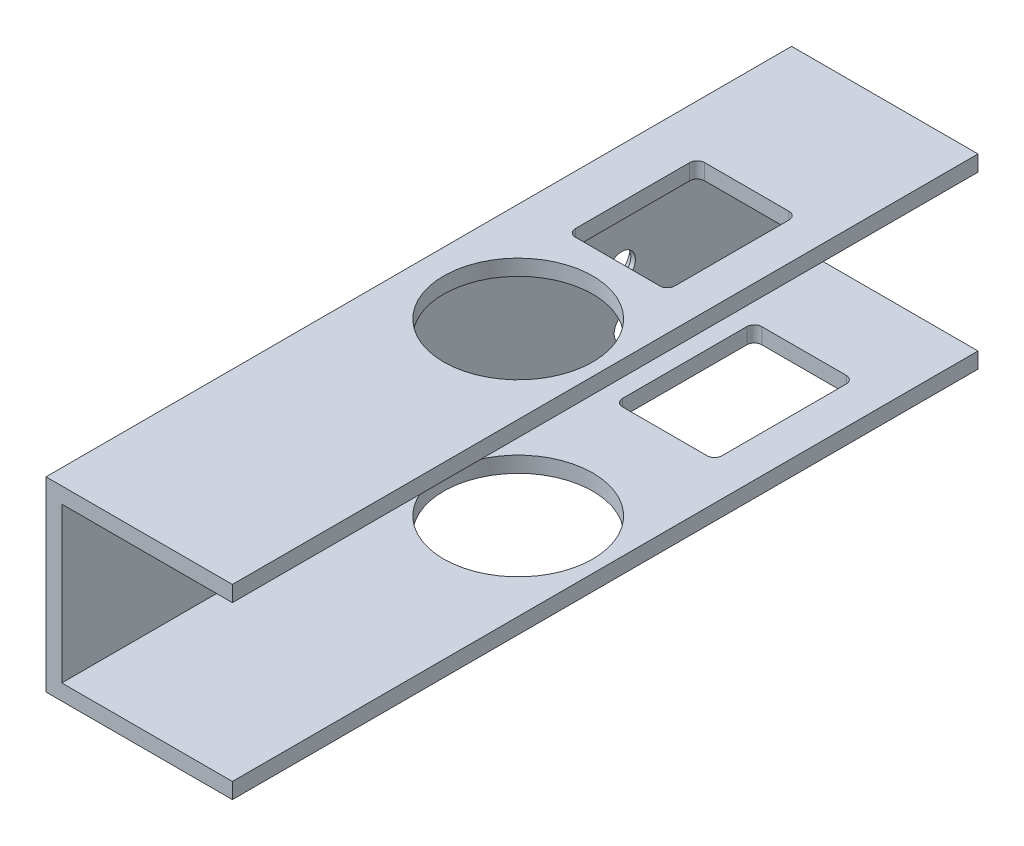
ISO-10303-21;
HEADER;
FILE_DESCRIPTION(('STEP AP214'),'2;1');
FILE_NAME('part.step','',(''),(''),'','','');
FILE_SCHEMA(('AUTOMOTIVE_DESIGN { 1 0 10303 214 1 1 1 1 }'));
ENDSEC;
DATA;
#1=APPLICATION_CONTEXT('core data for automotive mechanical design processes');
#2=APPLICATION_PROTOCOL_DEFINITION('international standard','automotive_design',2000,#1);
#3=PRODUCT_CONTEXT('',#1,'mechanical');
#4=PRODUCT('Part','Part','',(#3));
#5=PRODUCT_RELATED_PRODUCT_CATEGORY('part','',(#4));
#6=PRODUCT_DEFINITION_FORMATION('','',#4);
#7=PRODUCT_DEFINITION_CONTEXT('part definition',#1,'design');
#8=PRODUCT_DEFINITION('design','',#6,#7);
#9=PRODUCT_DEFINITION_SHAPE('','',#8);
#10=(LENGTH_UNIT() NAMED_UNIT(*) SI_UNIT(.MILLI.,.METRE.));
#11=(NAMED_UNIT(*) PLANE_ANGLE_UNIT() SI_UNIT($,.RADIAN.));
#12=(NAMED_UNIT(*) SI_UNIT($,.STERADIAN.) SOLID_ANGLE_UNIT());
#13=UNCERTAINTY_MEASURE_WITH_UNIT(LENGTH_MEASURE(1.E-05),#10,'distance_accuracy_value','');
#14=(GEOMETRIC_REPRESENTATION_CONTEXT(3) GLOBAL_UNCERTAINTY_ASSIGNED_CONTEXT((#13)) GLOBAL_UNIT_ASSIGNED_CONTEXT((#10,
#11,#12)) REPRESENTATION_CONTEXT('',''));
#15=CARTESIAN_POINT('',(0.,0.,0.));
#16=DIRECTION('',(0.,0.,1.));
#17=DIRECTION('',(1.,0.,0.));
#18=AXIS2_PLACEMENT_3D('',#15,#16,#17);
#19=CARTESIAN_POINT('',(75.,-37.5,300.));
#20=DIRECTION('',(0.,1.,0.));
#21=DIRECTION('',(0.,0.,1.));
#22=AXIS2_PLACEMENT_3D('',#19,#20,#21);
#23=PLANE('',#22);
#24=DIRECTION('',(0.,0.,-1.));
#25=VECTOR('',#24,1.);
#26=CARTESIAN_POINT('',(20.,-37.5,91.));
#27=LINE('',#26,#25);
#28=CARTESIAN_POINT('',(20.,-37.5,88.));
#29=VERTEX_POINT('',#28);
#30=CARTESIAN_POINT('',(20.,-37.5,38.));
#31=VERTEX_POINT('',#30);
#32=EDGE_CURVE('E352',#29,#31,#27,.T.);
#33=ORIENTED_EDGE('',*,*,#32,.F.);
#34=CARTESIAN_POINT('',(23.,-37.5,88.));
#35=DIRECTION('',(0.,1.,0.));
#36=DIRECTION('',(0.,0.,1.));
#37=AXIS2_PLACEMENT_3D('',#34,#35,#36);
#38=CIRCLE('',#37,3.);
#39=CARTESIAN_POINT('',(23.,-37.5,91.));
#40=VERTEX_POINT('',#39);
#41=EDGE_CURVE('E286',#29,#40,#38,.T.);
#42=ORIENTED_EDGE('',*,*,#41,.T.);
#43=DIRECTION('',(-1.,0.,0.));
#44=VECTOR('',#43,1.);
#45=CARTESIAN_POINT('',(20.,-37.5,91.));
#46=LINE('',#45,#44);
#47=CARTESIAN_POINT('',(57.,-37.5,91.));
#48=VERTEX_POINT('',#47);
#49=EDGE_CURVE('E349',#48,#40,#46,.T.);
#50=ORIENTED_EDGE('',*,*,#49,.F.);
#51=CARTESIAN_POINT('',(57.,-37.5,88.));
#52=DIRECTION('',(0.,1.,0.));
#53=DIRECTION('',(0.,0.,1.));
#54=AXIS2_PLACEMENT_3D('',#51,#52,#53);
#55=CIRCLE('',#54,3.);
#56=CARTESIAN_POINT('',(60.,-37.5,88.));
#57=VERTEX_POINT('',#56);
#58=EDGE_CURVE('E282',#48,#57,#55,.T.);
#59=ORIENTED_EDGE('',*,*,#58,.T.);
#60=DIRECTION('',(0.,0.,1.));
#61=VECTOR('',#60,1.);
#62=CARTESIAN_POINT('',(60.,-37.5,91.));
#63=LINE('',#62,#61);
#64=CARTESIAN_POINT('',(60.,-37.5,38.));
#65=VERTEX_POINT('',#64);
#66=EDGE_CURVE('E358',#65,#57,#63,.T.);
#67=ORIENTED_EDGE('',*,*,#66,.F.);
#68=CARTESIAN_POINT('',(57.,-37.5,38.));
#69=DIRECTION('',(0.,1.,0.));
#70=DIRECTION('',(0.,0.,1.));
#71=AXIS2_PLACEMENT_3D('',#68,#69,#70);
#72=CIRCLE('',#71,3.);
#73=CARTESIAN_POINT('',(57.,-37.5,35.));
#74=VERTEX_POINT('',#73);
#75=EDGE_CURVE('E278',#65,#74,#72,.T.);
#76=ORIENTED_EDGE('',*,*,#75,.T.);
#77=DIRECTION('',(1.,0.,0.));
#78=VECTOR('',#77,1.);
#79=CARTESIAN_POINT('',(20.,-37.5,35.));
#80=LINE('',#79,#78);
#81=CARTESIAN_POINT('',(23.,-37.5,35.));
#82=VERTEX_POINT('',#81);
#83=EDGE_CURVE('E355',#82,#74,#80,.T.);
#84=ORIENTED_EDGE('',*,*,#83,.F.);
#85=CARTESIAN_POINT('',(23.,-37.5,38.));
#86=DIRECTION('',(0.,1.,0.));
#87=DIRECTION('',(0.,0.,1.));
#88=AXIS2_PLACEMENT_3D('',#85,#86,#87);
#89=CIRCLE('',#88,3.);
#90=EDGE_CURVE('E290',#82,#31,#89,.T.);
#91=ORIENTED_EDGE('',*,*,#90,.T.);
#92=EDGE_LOOP('',(#33,#42,#50,#59,#67,#76,#84,#91));
#93=FACE_BOUND('',#92,.T.);
#94=CARTESIAN_POINT('',(40.,-37.5,150.));
#95=DIRECTION('',(0.,1.,0.));
#96=DIRECTION('',(0.,0.,1.));
#97=AXIS2_PLACEMENT_3D('',#94,#95,#96);
#98=CIRCLE('',#97,30.);
#99=CARTESIAN_POINT('',(40.,-37.5,180.));
#100=VERTEX_POINT('',#99);
#101=EDGE_CURVE('E362',#100,#100,#98,.T.);
#102=ORIENTED_EDGE('',*,*,#101,.T.);
#103=EDGE_LOOP('',(#102));
#104=FACE_BOUND('',#103,.T.);
#105=DIRECTION('',(1.,0.,0.));
#106=VECTOR('',#105,1.);
#107=CARTESIAN_POINT('',(75.,-37.5,0.));
#108=LINE('',#107,#106);
#109=CARTESIAN_POINT('',(0.,-37.5,0.));
#110=VERTEX_POINT('',#109);
#111=CARTESIAN_POINT('',(75.,-37.5,0.));
#112=VERTEX_POINT('',#111);
#113=EDGE_CURVE('E221',#110,#112,#108,.T.);
#114=ORIENTED_EDGE('',*,*,#113,.T.);
#115=DIRECTION('',(0.,0.,-1.));
#116=VECTOR('',#115,1.);
#117=CARTESIAN_POINT('',(75.,-37.5,300.));
#118=LINE('',#117,#116);
#119=CARTESIAN_POINT('',(75.,-37.5,300.));
#120=VERTEX_POINT('',#119);
#121=EDGE_CURVE('E202',#120,#112,#118,.T.);
#122=ORIENTED_EDGE('',*,*,#121,.F.);
#123=DIRECTION('',(1.,0.,0.));
#124=VECTOR('',#123,1.);
#125=CARTESIAN_POINT('',(75.,-37.5,300.));
#126=LINE('',#125,#124);
#127=CARTESIAN_POINT('',(0.,-37.5,300.));
#128=VERTEX_POINT('',#127);
#129=EDGE_CURVE('E209',#128,#120,#126,.T.);
#130=ORIENTED_EDGE('',*,*,#129,.F.);
#131=DIRECTION('',(0.,0.,-1.));
#132=VECTOR('',#131,1.);
#133=CARTESIAN_POINT('',(0.,-37.5,300.));
#134=LINE('',#133,#132);
#135=EDGE_CURVE('E383',#128,#110,#134,.T.);
#136=ORIENTED_EDGE('',*,*,#135,.T.);
#137=EDGE_LOOP('',(#114,#122,#130,#136));
#138=FACE_BOUND('',#137,.T.);
#139=ADVANCED_FACE('F34',(#93,#104,#138),#23,.F.);
#140=CARTESIAN_POINT('',(75.,-31.15,300.));
#141=DIRECTION('',(-1.,0.,0.));
#142=DIRECTION('',(0.,-1.,0.));
#143=AXIS2_PLACEMENT_3D('',#140,#141,#142);
#144=PLANE('',#143);
#145=DIRECTION('',(0.,1.,0.));
#146=VECTOR('',#145,1.);
#147=CARTESIAN_POINT('',(75.,-31.15,0.));
#148=LINE('',#147,#146);
#149=CARTESIAN_POINT('',(75.,-31.15,0.));
#150=VERTEX_POINT('',#149);
#151=EDGE_CURVE('E385',#112,#150,#148,.T.);
#152=ORIENTED_EDGE('',*,*,#151,.T.);
#153=DIRECTION('',(0.,0.,-1.));
#154=VECTOR('',#153,1.);
#155=CARTESIAN_POINT('',(75.,-31.15,300.));
#156=LINE('',#155,#154);
#157=CARTESIAN_POINT('',(75.,-31.15,300.));
#158=VERTEX_POINT('',#157);
#159=EDGE_CURVE('E205',#158,#150,#156,.T.);
#160=ORIENTED_EDGE('',*,*,#159,.F.);
#161=DIRECTION('',(0.,1.,0.));
#162=VECTOR('',#161,1.);
#163=CARTESIAN_POINT('',(75.,-31.15,300.));
#164=LINE('',#163,#162);
#165=EDGE_CURVE('E198',#120,#158,#164,.T.);
#166=ORIENTED_EDGE('',*,*,#165,.F.);
#167=ORIENTED_EDGE('',*,*,#121,.T.);
#168=EDGE_LOOP('',(#152,#160,#166,#167));
#169=FACE_BOUND('',#168,.T.);
#170=ADVANCED_FACE('F200',(#169),#144,.F.);
#171=CARTESIAN_POINT('',(6.35000000000001,-31.15,300.));
#172=DIRECTION('',(0.,-1.,0.));
#173=DIRECTION('',(0.,0.,-1.));
#174=AXIS2_PLACEMENT_3D('',#171,#172,#173);
#175=PLANE('',#174);
#176=DIRECTION('',(1.,0.,0.));
#177=VECTOR('',#176,1.);
#178=CARTESIAN_POINT('',(6.35000000000001,-31.15,35.));
#179=LINE('',#178,#177);
#180=CARTESIAN_POINT('',(23.,-31.15,35.));
#181=VERTEX_POINT('',#180);
#182=CARTESIAN_POINT('',(57.,-31.15,35.));
#183=VERTEX_POINT('',#182);
#184=EDGE_CURVE('E225',#181,#183,#179,.T.);
#185=ORIENTED_EDGE('',*,*,#184,.T.);
#186=CARTESIAN_POINT('',(57.,-31.15,38.));
#187=DIRECTION('',(0.,-1.,0.));
#188=DIRECTION('',(0.,0.,-1.));
#189=AXIS2_PLACEMENT_3D('',#186,#187,#188);
#190=CIRCLE('',#189,3.);
#191=CARTESIAN_POINT('',(60.,-31.15,38.));
#192=VERTEX_POINT('',#191);
#193=EDGE_CURVE('E280',#183,#192,#190,.T.);
#194=ORIENTED_EDGE('',*,*,#193,.T.);
#195=DIRECTION('',(0.,0.,1.));
#196=VECTOR('',#195,1.);
#197=CARTESIAN_POINT('',(59.9999999999999,-31.15,300.));
#198=LINE('',#197,#196);
#199=CARTESIAN_POINT('',(60.,-31.15,88.));
#200=VERTEX_POINT('',#199);
#201=EDGE_CURVE('E233',#192,#200,#198,.T.);
#202=ORIENTED_EDGE('',*,*,#201,.T.);
#203=CARTESIAN_POINT('',(57.,-31.15,88.));
#204=DIRECTION('',(0.,-1.,0.));
#205=DIRECTION('',(0.,0.,-1.));
#206=AXIS2_PLACEMENT_3D('',#203,#204,#205);
#207=CIRCLE('',#206,3.);
#208=CARTESIAN_POINT('',(57.,-31.15,91.));
#209=VERTEX_POINT('',#208);
#210=EDGE_CURVE('E284',#200,#209,#207,.T.);
#211=ORIENTED_EDGE('',*,*,#210,.T.);
#212=DIRECTION('',(-1.,0.,0.));
#213=VECTOR('',#212,1.);
#214=CARTESIAN_POINT('',(6.35000000000001,-31.15,91.));
#215=LINE('',#214,#213);
#216=CARTESIAN_POINT('',(23.,-31.15,91.));
#217=VERTEX_POINT('',#216);
#218=EDGE_CURVE('E236',#209,#217,#215,.T.);
#219=ORIENTED_EDGE('',*,*,#218,.T.);
#220=CARTESIAN_POINT('',(23.,-31.15,88.));
#221=DIRECTION('',(0.,-1.,0.));
#222=DIRECTION('',(0.,0.,-1.));
#223=AXIS2_PLACEMENT_3D('',#220,#221,#222);
#224=CIRCLE('',#223,3.);
#225=CARTESIAN_POINT('',(20.,-31.15,88.));
#226=VERTEX_POINT('',#225);
#227=EDGE_CURVE('E288',#217,#226,#224,.T.);
#228=ORIENTED_EDGE('',*,*,#227,.T.);
#229=DIRECTION('',(0.,0.,-1.));
#230=VECTOR('',#229,1.);
#231=CARTESIAN_POINT('',(20.0000000000001,-31.15,300.));
#232=LINE('',#231,#230);
#233=CARTESIAN_POINT('',(20.,-31.15,38.));
#234=VERTEX_POINT('',#233);
#235=EDGE_CURVE('E222',#226,#234,#232,.T.);
#236=ORIENTED_EDGE('',*,*,#235,.T.);
#237=CARTESIAN_POINT('',(23.,-31.15,38.));
#238=DIRECTION('',(0.,-1.,0.));
#239=DIRECTION('',(0.,0.,-1.));
#240=AXIS2_PLACEMENT_3D('',#237,#238,#239);
#241=CIRCLE('',#240,3.);
#242=EDGE_CURVE('E292',#234,#181,#241,.T.);
#243=ORIENTED_EDGE('',*,*,#242,.T.);
#244=EDGE_LOOP('',(#185,#194,#202,#211,#219,#228,#236,#243));
#245=FACE_BOUND('',#244,.T.);
#246=CARTESIAN_POINT('',(40.,-31.15,150.));
#247=DIRECTION('',(0.,-1.,0.));
#248=DIRECTION('',(0.,0.,-1.));
#249=AXIS2_PLACEMENT_3D('',#246,#247,#248);
#250=CIRCLE('',#249,30.);
#251=CARTESIAN_POINT('',(40.,-31.15,120.));
#252=VERTEX_POINT('',#251);
#253=EDGE_CURVE('E370',#252,#252,#250,.T.);
#254=ORIENTED_EDGE('',*,*,#253,.T.);
#255=EDGE_LOOP('',(#254));
#256=FACE_BOUND('',#255,.T.);
#257=DIRECTION('',(-1.,0.,0.));
#258=VECTOR('',#257,1.);
#259=CARTESIAN_POINT('',(6.35000000000001,-31.15,0.));
#260=LINE('',#259,#258);
#261=CARTESIAN_POINT('',(6.35000000000001,-31.15,0.));
#262=VERTEX_POINT('',#261);
#263=EDGE_CURVE('E387',#150,#262,#260,.T.);
#264=ORIENTED_EDGE('',*,*,#263,.T.);
#265=DIRECTION('',(0.,0.,-1.));
#266=VECTOR('',#265,1.);
#267=CARTESIAN_POINT('',(6.35000000000001,-31.15,300.));
#268=LINE('',#267,#266);
#269=CARTESIAN_POINT('',(6.35000000000001,-31.15,300.));
#270=VERTEX_POINT('',#269);
#271=EDGE_CURVE('E227',#270,#262,#268,.T.);
#272=ORIENTED_EDGE('',*,*,#271,.F.);
#273=DIRECTION('',(-1.,0.,0.));
#274=VECTOR('',#273,1.);
#275=CARTESIAN_POINT('',(6.35000000000001,-31.15,300.));
#276=LINE('',#275,#274);
#277=EDGE_CURVE('E208',#158,#270,#276,.T.);
#278=ORIENTED_EDGE('',*,*,#277,.F.);
#279=ORIENTED_EDGE('',*,*,#159,.T.);
#280=EDGE_LOOP('',(#264,#272,#278,#279));
#281=FACE_BOUND('',#280,.T.);
#282=ADVANCED_FACE('F434',(#245,#256,#281),#175,.F.);
#283=CARTESIAN_POINT('',(6.35000000000001,31.15,300.));
#284=DIRECTION('',(-1.,0.,0.));
#285=DIRECTION('',(0.,0.,1.));
#286=AXIS2_PLACEMENT_3D('',#283,#284,#285);
#287=PLANE('',#286);
#288=CARTESIAN_POINT('',(6.35000000000001,1.01110333021214,74.7041216047486));
#289=DIRECTION('',(-1.,0.,0.));
#290=DIRECTION('',(0.,0.,1.));
#291=AXIS2_PLACEMENT_3D('',#288,#289,#290);
#292=CIRCLE('',#291,5.49999999999999);
#293=CARTESIAN_POINT('',(6.35000000000001,1.01110333021214,80.2041216047486));
#294=VERTEX_POINT('',#293);
#295=EDGE_CURVE('E38',#294,#294,#292,.T.);
#296=ORIENTED_EDGE('',*,*,#295,.T.);
#297=EDGE_LOOP('',(#296));
#298=FACE_BOUND('',#297,.T.);
#299=CARTESIAN_POINT('',(6.35000000000001,-20.6,72.2499999999999));
#300=DIRECTION('',(-1.,0.,0.));
#301=DIRECTION('',(0.,0.,1.));
#302=AXIS2_PLACEMENT_3D('',#299,#300,#301);
#303=CIRCLE('',#302,5.49999999999999);
#304=CARTESIAN_POINT('',(6.35000000000001,-20.6,77.7499999999999));
#305=VERTEX_POINT('',#304);
#306=EDGE_CURVE('E310',#305,#305,#303,.T.);
#307=ORIENTED_EDGE('',*,*,#306,.T.);
#308=EDGE_LOOP('',(#307));
#309=FACE_BOUND('',#308,.T.);
#310=CARTESIAN_POINT('',(6.35000000000001,23.1883817430436,79.83600402466));
#311=DIRECTION('',(-1.,0.,0.));
#312=DIRECTION('',(0.,0.,1.));
#313=AXIS2_PLACEMENT_3D('',#310,#311,#312);
#314=CIRCLE('',#313,5.49999999999999);
#315=CARTESIAN_POINT('',(6.35000000000001,23.1883817430436,85.3360040246599));
#316=VERTEX_POINT('',#315);
#317=EDGE_CURVE('E306',#316,#316,#314,.T.);
#318=ORIENTED_EDGE('',*,*,#317,.T.);
#319=EDGE_LOOP('',(#318));
#320=FACE_BOUND('',#319,.T.);
#321=DIRECTION('',(0.,1.,0.));
#322=VECTOR('',#321,1.);
#323=CARTESIAN_POINT('',(6.35000000000001,31.15,0.));
#324=LINE('',#323,#322);
#325=CARTESIAN_POINT('',(6.35000000000001,31.15,0.));
#326=VERTEX_POINT('',#325);
#327=EDGE_CURVE('E389',#262,#326,#324,.T.);
#328=ORIENTED_EDGE('',*,*,#327,.T.);
#329=DIRECTION('',(0.,0.,-1.));
#330=VECTOR('',#329,1.);
#331=CARTESIAN_POINT('',(6.35000000000001,31.15,300.));
#332=LINE('',#331,#330);
#333=CARTESIAN_POINT('',(6.35000000000001,31.15,300.));
#334=VERTEX_POINT('',#333);
#335=EDGE_CURVE('E408',#334,#326,#332,.T.);
#336=ORIENTED_EDGE('',*,*,#335,.F.);
#337=DIRECTION('',(0.,1.,0.));
#338=VECTOR('',#337,1.);
#339=CARTESIAN_POINT('',(6.35000000000001,31.15,300.));
#340=LINE('',#339,#338);
#341=EDGE_CURVE('E374',#270,#334,#340,.T.);
#342=ORIENTED_EDGE('',*,*,#341,.F.);
#343=ORIENTED_EDGE('',*,*,#271,.T.);
#344=EDGE_LOOP('',(#328,#336,#342,#343));
#345=FACE_BOUND('',#344,.T.);
#346=ADVANCED_FACE('F415',(#298,#309,#320,#345),#287,.F.);
#347=CARTESIAN_POINT('',(75.,31.15,300.));
#348=DIRECTION('',(0.,1.,0.));
#349=DIRECTION('',(0.,0.,1.));
#350=AXIS2_PLACEMENT_3D('',#347,#348,#349);
#351=PLANE('',#350);
#352=DIRECTION('',(-1.,0.,0.));
#353=VECTOR('',#352,1.);
#354=CARTESIAN_POINT('',(74.9999999999999,31.15,58.));
#355=LINE('',#354,#353);
#356=CARTESIAN_POINT('',(57.,31.15,58.));
#357=VERTEX_POINT('',#356);
#358=CARTESIAN_POINT('',(23.,31.15,58.));
#359=VERTEX_POINT('',#358);
#360=EDGE_CURVE('E342',#357,#359,#355,.T.);
#361=ORIENTED_EDGE('',*,*,#360,.T.);
#362=CARTESIAN_POINT('',(23.,31.15,61.));
#363=DIRECTION('',(0.,1.,0.));
#364=DIRECTION('',(0.,0.,1.));
#365=AXIS2_PLACEMENT_3D('',#362,#363,#364);
#366=CIRCLE('',#365,3.);
#367=CARTESIAN_POINT('',(20.,31.15,61.));
#368=VERTEX_POINT('',#367);
#369=EDGE_CURVE('E58',#359,#368,#366,.T.);
#370=ORIENTED_EDGE('',*,*,#369,.T.);
#371=DIRECTION('',(0.,0.,1.));
#372=VECTOR('',#371,1.);
#373=CARTESIAN_POINT('',(20.,31.15,300.));
#374=LINE('',#373,#372);
#375=CARTESIAN_POINT('',(20.,31.15,107.));
#376=VERTEX_POINT('',#375);
#377=EDGE_CURVE('E344',#368,#376,#374,.T.);
#378=ORIENTED_EDGE('',*,*,#377,.T.);
#379=CARTESIAN_POINT('',(23.,31.15,107.));
#380=DIRECTION('',(0.,1.,0.));
#381=DIRECTION('',(0.,0.,1.));
#382=AXIS2_PLACEMENT_3D('',#379,#380,#381);
#383=CIRCLE('',#382,3.);
#384=CARTESIAN_POINT('',(23.,31.15,110.));
#385=VERTEX_POINT('',#384);
#386=EDGE_CURVE('E11',#376,#385,#383,.T.);
#387=ORIENTED_EDGE('',*,*,#386,.T.);
#388=DIRECTION('',(1.,0.,0.));
#389=VECTOR('',#388,1.);
#390=CARTESIAN_POINT('',(75.,31.15,110.));
#391=LINE('',#390,#389);
#392=CARTESIAN_POINT('',(57.,31.15,110.));
#393=VERTEX_POINT('',#392);
#394=EDGE_CURVE('E346',#385,#393,#391,.T.);
#395=ORIENTED_EDGE('',*,*,#394,.T.);
#396=CARTESIAN_POINT('',(57.,31.15,107.));
#397=DIRECTION('',(0.,1.,0.));
#398=DIRECTION('',(0.,0.,1.));
#399=AXIS2_PLACEMENT_3D('',#396,#397,#398);
#400=CIRCLE('',#399,3.);
#401=CARTESIAN_POINT('',(60.,31.15,107.));
#402=VERTEX_POINT('',#401);
#403=EDGE_CURVE('E296',#393,#402,#400,.T.);
#404=ORIENTED_EDGE('',*,*,#403,.T.);
#405=DIRECTION('',(0.,0.,-1.));
#406=VECTOR('',#405,1.);
#407=CARTESIAN_POINT('',(60.,31.15,300.));
#408=LINE('',#407,#406);
#409=CARTESIAN_POINT('',(60.,31.15,61.));
#410=VERTEX_POINT('',#409);
#411=EDGE_CURVE('E339',#402,#410,#408,.T.);
#412=ORIENTED_EDGE('',*,*,#411,.T.);
#413=CARTESIAN_POINT('',(57.,31.15,61.));
#414=DIRECTION('',(0.,1.,0.));
#415=DIRECTION('',(0.,0.,1.));
#416=AXIS2_PLACEMENT_3D('',#413,#414,#415);
#417=CIRCLE('',#416,3.);
#418=EDGE_CURVE('E300',#410,#357,#417,.T.);
#419=ORIENTED_EDGE('',*,*,#418,.T.);
#420=EDGE_LOOP('',(#361,#370,#378,#387,#395,#404,#412,#419));
#421=FACE_BOUND('',#420,.T.);
#422=CARTESIAN_POINT('',(40.,31.15,150.));
#423=DIRECTION('',(0.,1.,0.));
#424=DIRECTION('',(0.,0.,1.));
#425=AXIS2_PLACEMENT_3D('',#422,#423,#424);
#426=CIRCLE('',#425,30.);
#427=CARTESIAN_POINT('',(40.,31.15,180.));
#428=VERTEX_POINT('',#427);
#429=EDGE_CURVE('E365',#428,#428,#426,.T.);
#430=ORIENTED_EDGE('',*,*,#429,.T.);
#431=EDGE_LOOP('',(#430));
#432=FACE_BOUND('',#431,.T.);
#433=DIRECTION('',(1.,0.,0.));
#434=VECTOR('',#433,1.);
#435=CARTESIAN_POINT('',(75.,31.15,0.));
#436=LINE('',#435,#434);
#437=CARTESIAN_POINT('',(75.,31.15,0.));
#438=VERTEX_POINT('',#437);
#439=EDGE_CURVE('E391',#326,#438,#436,.T.);
#440=ORIENTED_EDGE('',*,*,#439,.T.);
#441=DIRECTION('',(0.,0.,-1.));
#442=VECTOR('',#441,1.);
#443=CARTESIAN_POINT('',(75.,31.15,300.));
#444=LINE('',#443,#442);
#445=CARTESIAN_POINT('',(75.,31.15,300.));
#446=VERTEX_POINT('',#445);
#447=EDGE_CURVE('E405',#446,#438,#444,.T.);
#448=ORIENTED_EDGE('',*,*,#447,.F.);
#449=DIRECTION('',(1.,0.,0.));
#450=VECTOR('',#449,1.);
#451=CARTESIAN_POINT('',(75.,31.15,300.));
#452=LINE('',#451,#450);
#453=EDGE_CURVE('E376',#334,#446,#452,.T.);
#454=ORIENTED_EDGE('',*,*,#453,.F.);
#455=ORIENTED_EDGE('',*,*,#335,.T.);
#456=EDGE_LOOP('',(#440,#448,#454,#455));
#457=FACE_BOUND('',#456,.T.);
#458=ADVANCED_FACE('F426',(#421,#432,#457),#351,.F.);
#459=CARTESIAN_POINT('',(75.,37.5,300.));
#460=DIRECTION('',(-1.,0.,0.));
#461=DIRECTION('',(0.,-1.,0.));
#462=AXIS2_PLACEMENT_3D('',#459,#460,#461);
#463=PLANE('',#462);
#464=DIRECTION('',(0.,1.,0.));
#465=VECTOR('',#464,1.);
#466=CARTESIAN_POINT('',(75.,37.5,0.));
#467=LINE('',#466,#465);
#468=CARTESIAN_POINT('',(75.,37.5,0.));
#469=VERTEX_POINT('',#468);
#470=EDGE_CURVE('E393',#438,#469,#467,.T.);
#471=ORIENTED_EDGE('',*,*,#470,.T.);
#472=DIRECTION('',(0.,0.,-1.));
#473=VECTOR('',#472,1.);
#474=CARTESIAN_POINT('',(75.,37.5,300.));
#475=LINE('',#474,#473);
#476=CARTESIAN_POINT('',(75.,37.5,300.));
#477=VERTEX_POINT('',#476);
#478=EDGE_CURVE('E402',#477,#469,#475,.T.);
#479=ORIENTED_EDGE('',*,*,#478,.F.);
#480=DIRECTION('',(0.,1.,0.));
#481=VECTOR('',#480,1.);
#482=CARTESIAN_POINT('',(75.,37.5,300.));
#483=LINE('',#482,#481);
#484=EDGE_CURVE('E378',#446,#477,#483,.T.);
#485=ORIENTED_EDGE('',*,*,#484,.F.);
#486=ORIENTED_EDGE('',*,*,#447,.T.);
#487=EDGE_LOOP('',(#471,#479,#485,#486));
#488=FACE_BOUND('',#487,.T.);
#489=ADVANCED_FACE('F430',(#488),#463,.F.);
#490=CARTESIAN_POINT('',(0.,37.5,300.));
#491=DIRECTION('',(0.,-1.,0.));
#492=DIRECTION('',(0.,0.,-1.));
#493=AXIS2_PLACEMENT_3D('',#490,#491,#492);
#494=PLANE('',#493);
#495=DIRECTION('',(0.,0.,-1.));
#496=VECTOR('',#495,1.);
#497=CARTESIAN_POINT('',(60.,37.5,110.));
#498=LINE('',#497,#496);
#499=CARTESIAN_POINT('',(60.,37.5,107.));
#500=VERTEX_POINT('',#499);
#501=CARTESIAN_POINT('',(60.,37.5,61.));
#502=VERTEX_POINT('',#501);
#503=EDGE_CURVE('E331',#500,#502,#498,.T.);
#504=ORIENTED_EDGE('',*,*,#503,.F.);
#505=CARTESIAN_POINT('',(57.,37.5,107.));
#506=DIRECTION('',(0.,-1.,0.));
#507=DIRECTION('',(0.,0.,-1.));
#508=AXIS2_PLACEMENT_3D('',#505,#506,#507);
#509=CIRCLE('',#508,3.);
#510=CARTESIAN_POINT('',(57.,37.5,110.));
#511=VERTEX_POINT('',#510);
#512=EDGE_CURVE('E294',#500,#511,#509,.T.);
#513=ORIENTED_EDGE('',*,*,#512,.T.);
#514=DIRECTION('',(1.,0.,0.));
#515=VECTOR('',#514,1.);
#516=CARTESIAN_POINT('',(60.,37.5,110.));
#517=LINE('',#516,#515);
#518=CARTESIAN_POINT('',(23.,37.5,110.));
#519=VERTEX_POINT('',#518);
#520=EDGE_CURVE('E308',#519,#511,#517,.T.);
#521=ORIENTED_EDGE('',*,*,#520,.F.);
#522=CARTESIAN_POINT('',(23.,37.5,107.));
#523=DIRECTION('',(0.,-1.,0.));
#524=DIRECTION('',(0.,0.,-1.));
#525=AXIS2_PLACEMENT_3D('',#522,#523,#524);
#526=CIRCLE('',#525,3.);
#527=CARTESIAN_POINT('',(20.,37.5,107.));
#528=VERTEX_POINT('',#527);
#529=EDGE_CURVE('E43',#519,#528,#526,.T.);
#530=ORIENTED_EDGE('',*,*,#529,.T.);
#531=DIRECTION('',(0.,0.,1.));
#532=VECTOR('',#531,1.);
#533=CARTESIAN_POINT('',(20.,37.5,110.));
#534=LINE('',#533,#532);
#535=CARTESIAN_POINT('',(20.,37.5,61.));
#536=VERTEX_POINT('',#535);
#537=EDGE_CURVE('E337',#536,#528,#534,.T.);
#538=ORIENTED_EDGE('',*,*,#537,.F.);
#539=CARTESIAN_POINT('',(23.,37.5,61.));
#540=DIRECTION('',(0.,-1.,0.));
#541=DIRECTION('',(0.,0.,-1.));
#542=AXIS2_PLACEMENT_3D('',#539,#540,#541);
#543=CIRCLE('',#542,3.);
#544=CARTESIAN_POINT('',(23.,37.5,58.));
#545=VERTEX_POINT('',#544);
#546=EDGE_CURVE('E302',#536,#545,#543,.T.);
#547=ORIENTED_EDGE('',*,*,#546,.T.);
#548=DIRECTION('',(-1.,0.,0.));
#549=VECTOR('',#548,1.);
#550=CARTESIAN_POINT('',(60.,37.5,58.));
#551=LINE('',#550,#549);
#552=CARTESIAN_POINT('',(57.,37.5,58.));
#553=VERTEX_POINT('',#552);
#554=EDGE_CURVE('E334',#553,#545,#551,.T.);
#555=ORIENTED_EDGE('',*,*,#554,.F.);
#556=CARTESIAN_POINT('',(57.,37.5,61.));
#557=DIRECTION('',(0.,-1.,0.));
#558=DIRECTION('',(0.,0.,-1.));
#559=AXIS2_PLACEMENT_3D('',#556,#557,#558);
#560=CIRCLE('',#559,3.);
#561=EDGE_CURVE('E298',#553,#502,#560,.T.);
#562=ORIENTED_EDGE('',*,*,#561,.T.);
#563=EDGE_LOOP('',(#504,#513,#521,#530,#538,#547,#555,#562));
#564=FACE_BOUND('',#563,.T.);
#565=CARTESIAN_POINT('',(40.,37.5,150.));
#566=DIRECTION('',(0.,1.,0.));
#567=DIRECTION('',(0.,0.,1.));
#568=AXIS2_PLACEMENT_3D('',#565,#566,#567);
#569=CIRCLE('',#568,30.);
#570=CARTESIAN_POINT('',(40.,37.5,180.));
#571=VERTEX_POINT('',#570);
#572=EDGE_CURVE('E361',#571,#571,#569,.T.);
#573=ORIENTED_EDGE('',*,*,#572,.F.);
#574=EDGE_LOOP('',(#573));
#575=FACE_BOUND('',#574,.T.);
#576=DIRECTION('',(-1.,0.,0.));
#577=VECTOR('',#576,1.);
#578=CARTESIAN_POINT('',(0.,37.5,0.));
#579=LINE('',#578,#577);
#580=CARTESIAN_POINT('',(0.,37.5,0.));
#581=VERTEX_POINT('',#580);
#582=EDGE_CURVE('E395',#469,#581,#579,.T.);
#583=ORIENTED_EDGE('',*,*,#582,.T.);
#584=DIRECTION('',(0.,0.,-1.));
#585=VECTOR('',#584,1.);
#586=CARTESIAN_POINT('',(0.,37.5,300.));
#587=LINE('',#586,#585);
#588=CARTESIAN_POINT('',(0.,37.5,300.));
#589=VERTEX_POINT('',#588);
#590=EDGE_CURVE('E399',#589,#581,#587,.T.);
#591=ORIENTED_EDGE('',*,*,#590,.F.);
#592=DIRECTION('',(-1.,0.,0.));
#593=VECTOR('',#592,1.);
#594=CARTESIAN_POINT('',(0.,37.5,300.));
#595=LINE('',#594,#593);
#596=EDGE_CURVE('E380',#477,#589,#595,.T.);
#597=ORIENTED_EDGE('',*,*,#596,.F.);
#598=ORIENTED_EDGE('',*,*,#478,.T.);
#599=EDGE_LOOP('',(#583,#591,#597,#598));
#600=FACE_BOUND('',#599,.T.);
#601=ADVANCED_FACE('F494',(#564,#575,#600),#494,.F.);
#602=CARTESIAN_POINT('',(0.,-37.5,300.));
#603=DIRECTION('',(1.,0.,0.));
#604=DIRECTION('',(0.,0.,-1.));
#605=AXIS2_PLACEMENT_3D('',#602,#603,#604);
#606=PLANE('',#605);
#607=CARTESIAN_POINT('',(0.,1.01110333021214,74.7041216047486));
#608=DIRECTION('',(-1.,0.,0.));
#609=DIRECTION('',(0.,0.,1.));
#610=AXIS2_PLACEMENT_3D('',#607,#608,#609);
#611=CIRCLE('',#610,10.);
#612=CARTESIAN_POINT('',(0.,1.01110333021214,84.7041216047486));
#613=VERTEX_POINT('',#612);
#614=EDGE_CURVE('E732',#613,#613,#611,.T.);
#615=ORIENTED_EDGE('',*,*,#614,.F.);
#616=EDGE_LOOP('',(#615));
#617=FACE_BOUND('',#616,.T.);
#618=CARTESIAN_POINT('',(0.,-20.6,72.2499999999999));
#619=DIRECTION('',(-1.,0.,0.));
#620=DIRECTION('',(0.,0.,1.));
#621=AXIS2_PLACEMENT_3D('',#618,#619,#620);
#622=CIRCLE('',#621,10.);
#623=CARTESIAN_POINT('',(0.,-20.6,82.2499999999999));
#624=VERTEX_POINT('',#623);
#625=EDGE_CURVE('E319',#624,#624,#622,.T.);
#626=ORIENTED_EDGE('',*,*,#625,.F.);
#627=EDGE_LOOP('',(#626));
#628=FACE_BOUND('',#627,.T.);
#629=CARTESIAN_POINT('',(0.,23.1883817430436,79.83600402466));
#630=DIRECTION('',(-1.,0.,0.));
#631=DIRECTION('',(0.,0.,1.));
#632=AXIS2_PLACEMENT_3D('',#629,#630,#631);
#633=CIRCLE('',#632,10.);
#634=CARTESIAN_POINT('',(0.,23.1883817430436,89.83600402466));
#635=VERTEX_POINT('',#634);
#636=EDGE_CURVE('E312',#635,#635,#633,.T.);
#637=ORIENTED_EDGE('',*,*,#636,.F.);
#638=EDGE_LOOP('',(#637));
#639=FACE_BOUND('',#638,.T.);
#640=DIRECTION('',(0.,-1.,0.));
#641=VECTOR('',#640,1.);
#642=CARTESIAN_POINT('',(0.,-37.5,0.));
#643=LINE('',#642,#641);
#644=EDGE_CURVE('E218',#581,#110,#643,.T.);
#645=ORIENTED_EDGE('',*,*,#644,.T.);
#646=ORIENTED_EDGE('',*,*,#135,.F.);
#647=DIRECTION('',(0.,-1.,0.));
#648=VECTOR('',#647,1.);
#649=CARTESIAN_POINT('',(0.,-37.5,300.));
#650=LINE('',#649,#648);
#651=EDGE_CURVE('E214',#589,#128,#650,.T.);
#652=ORIENTED_EDGE('',*,*,#651,.F.);
#653=ORIENTED_EDGE('',*,*,#590,.T.);
#654=EDGE_LOOP('',(#645,#646,#652,#653));
#655=FACE_BOUND('',#654,.T.);
#656=ADVANCED_FACE('F550',(#617,#628,#639,#655),#606,.F.);
#657=CARTESIAN_POINT('',(0.,0.,300.));
#658=DIRECTION('',(0.,0.,-1.));
#659=DIRECTION('',(-1.,0.,0.));
#660=AXIS2_PLACEMENT_3D('',#657,#658,#659);
#661=PLANE('',#660);
#662=ORIENTED_EDGE('',*,*,#129,.T.);
#663=ORIENTED_EDGE('',*,*,#165,.T.);
#664=ORIENTED_EDGE('',*,*,#277,.T.);
#665=ORIENTED_EDGE('',*,*,#341,.T.);
#666=ORIENTED_EDGE('',*,*,#453,.T.);
#667=ORIENTED_EDGE('',*,*,#484,.T.);
#668=ORIENTED_EDGE('',*,*,#596,.T.);
#669=ORIENTED_EDGE('',*,*,#651,.T.);
#670=EDGE_LOOP('',(#662,#663,#664,#665,#666,#667,#668,#669));
#671=FACE_BOUND('',#670,.T.);
#672=ADVANCED_FACE('F212',(#671),#661,.F.);
#673=CARTESIAN_POINT('',(0.,0.,0.));
#674=DIRECTION('',(0.,0.,-1.));
#675=DIRECTION('',(-1.,0.,0.));
#676=AXIS2_PLACEMENT_3D('',#673,#674,#675);
#677=PLANE('',#676);
#678=ORIENTED_EDGE('',*,*,#113,.F.);
#679=ORIENTED_EDGE('',*,*,#644,.F.);
#680=ORIENTED_EDGE('',*,*,#582,.F.);
#681=ORIENTED_EDGE('',*,*,#470,.F.);
#682=ORIENTED_EDGE('',*,*,#439,.F.);
#683=ORIENTED_EDGE('',*,*,#327,.F.);
#684=ORIENTED_EDGE('',*,*,#263,.F.);
#685=ORIENTED_EDGE('',*,*,#151,.F.);
#686=EDGE_LOOP('',(#678,#679,#680,#681,#682,#683,#684,#685));
#687=FACE_BOUND('',#686,.T.);
#688=ADVANCED_FACE('F421',(#687),#677,.T.);
#689=CARTESIAN_POINT('',(40.,-37.5,150.));
#690=DIRECTION('',(0.,1.,0.));
#691=DIRECTION('',(0.,0.,1.));
#692=AXIS2_PLACEMENT_3D('',#689,#690,#691);
#693=CYLINDRICAL_SURFACE('',#692,30.);
#694=ORIENTED_EDGE('',*,*,#572,.T.);
#695=EDGE_LOOP('',(#694));
#696=FACE_BOUND('',#695,.T.);
#697=ORIENTED_EDGE('',*,*,#429,.F.);
#698=EDGE_LOOP('',(#697));
#699=FACE_BOUND('',#698,.T.);
#700=ADVANCED_FACE('F546',(#696,#699),#693,.F.);
#701=ORIENTED_EDGE('',*,*,#101,.F.);
#702=EDGE_LOOP('',(#701));
#703=FACE_BOUND('',#702,.T.);
#704=ORIENTED_EDGE('',*,*,#253,.F.);
#705=EDGE_LOOP('',(#704));
#706=FACE_BOUND('',#705,.T.);
#707=ADVANCED_FACE('F542',(#703,#706),#693,.F.);
#708=CARTESIAN_POINT('',(20.,-27.5,91.));
#709=DIRECTION('',(0.,0.,1.));
#710=DIRECTION('',(1.,0.,0.));
#711=AXIS2_PLACEMENT_3D('',#708,#709,#710);
#712=PLANE('',#711);
#713=ORIENTED_EDGE('',*,*,#218,.F.);
#714=DIRECTION('',(0.,-1.,0.));
#715=VECTOR('',#714,1.);
#716=CARTESIAN_POINT('',(57.,-37.5,91.));
#717=LINE('',#716,#715);
#718=EDGE_CURVE('E251',#209,#48,#717,.T.);
#719=ORIENTED_EDGE('',*,*,#718,.T.);
#720=ORIENTED_EDGE('',*,*,#49,.T.);
#721=DIRECTION('',(0.,-1.,0.));
#722=VECTOR('',#721,1.);
#723=CARTESIAN_POINT('',(23.,-31.15,91.));
#724=LINE('',#723,#722);
#725=EDGE_CURVE('E249',#40,#217,#724,.F.);
#726=ORIENTED_EDGE('',*,*,#725,.T.);
#727=EDGE_LOOP('',(#713,#719,#720,#726));
#728=FACE_BOUND('',#727,.T.);
#729=ADVANCED_FACE('F532',(#728),#712,.F.);
#730=CARTESIAN_POINT('',(60.,-27.5,91.));
#731=DIRECTION('',(1.,0.,0.));
#732=DIRECTION('',(0.,0.,-1.));
#733=AXIS2_PLACEMENT_3D('',#730,#731,#732);
#734=PLANE('',#733);
#735=ORIENTED_EDGE('',*,*,#201,.F.);
#736=DIRECTION('',(0.,-1.,0.));
#737=VECTOR('',#736,1.);
#738=CARTESIAN_POINT('',(60.,-37.5,38.));
#739=LINE('',#738,#737);
#740=EDGE_CURVE('E241',#192,#65,#739,.T.);
#741=ORIENTED_EDGE('',*,*,#740,.T.);
#742=ORIENTED_EDGE('',*,*,#66,.T.);
#743=DIRECTION('',(0.,-1.,0.));
#744=VECTOR('',#743,1.);
#745=CARTESIAN_POINT('',(60.,-31.15,88.));
#746=LINE('',#745,#744);
#747=EDGE_CURVE('E239',#57,#200,#746,.F.);
#748=ORIENTED_EDGE('',*,*,#747,.T.);
#749=EDGE_LOOP('',(#735,#741,#742,#748));
#750=FACE_BOUND('',#749,.T.);
#751=ADVANCED_FACE('F528',(#750),#734,.F.);
#752=CARTESIAN_POINT('',(20.,-27.5,35.));
#753=DIRECTION('',(0.,0.,-1.));
#754=DIRECTION('',(-1.,0.,0.));
#755=AXIS2_PLACEMENT_3D('',#752,#753,#754);
#756=PLANE('',#755);
#757=ORIENTED_EDGE('',*,*,#83,.T.);
#758=DIRECTION('',(0.,-1.,0.));
#759=VECTOR('',#758,1.);
#760=CARTESIAN_POINT('',(57.,-31.15,35.));
#761=LINE('',#760,#759);
#762=EDGE_CURVE('E247',#74,#183,#761,.F.);
#763=ORIENTED_EDGE('',*,*,#762,.T.);
#764=ORIENTED_EDGE('',*,*,#184,.F.);
#765=DIRECTION('',(0.,-1.,0.));
#766=VECTOR('',#765,1.);
#767=CARTESIAN_POINT('',(23.,-37.5,35.));
#768=LINE('',#767,#766);
#769=EDGE_CURVE('E244',#181,#82,#768,.T.);
#770=ORIENTED_EDGE('',*,*,#769,.T.);
#771=EDGE_LOOP('',(#757,#763,#764,#770));
#772=FACE_BOUND('',#771,.T.);
#773=ADVANCED_FACE('F531',(#772),#756,.F.);
#774=CARTESIAN_POINT('',(20.,-27.5,91.));
#775=DIRECTION('',(-1.,0.,0.));
#776=DIRECTION('',(0.,0.,1.));
#777=AXIS2_PLACEMENT_3D('',#774,#775,#776);
#778=PLANE('',#777);
#779=ORIENTED_EDGE('',*,*,#235,.F.);
#780=DIRECTION('',(0.,-1.,0.));
#781=VECTOR('',#780,1.);
#782=CARTESIAN_POINT('',(20.,-37.5,88.));
#783=LINE('',#782,#781);
#784=EDGE_CURVE('E256',#226,#29,#783,.T.);
#785=ORIENTED_EDGE('',*,*,#784,.T.);
#786=ORIENTED_EDGE('',*,*,#32,.T.);
#787=DIRECTION('',(0.,-1.,0.));
#788=VECTOR('',#787,1.);
#789=CARTESIAN_POINT('',(20.,-31.15,38.));
#790=LINE('',#789,#788);
#791=EDGE_CURVE('E254',#31,#234,#790,.F.);
#792=ORIENTED_EDGE('',*,*,#791,.T.);
#793=EDGE_LOOP('',(#779,#785,#786,#792));
#794=FACE_BOUND('',#793,.T.);
#795=ADVANCED_FACE('F527',(#794),#778,.F.);
#796=CARTESIAN_POINT('',(60.,27.5,110.));
#797=DIRECTION('',(0.,0.,1.));
#798=DIRECTION('',(1.,0.,0.));
#799=AXIS2_PLACEMENT_3D('',#796,#797,#798);
#800=PLANE('',#799);
#801=ORIENTED_EDGE('',*,*,#520,.T.);
#802=DIRECTION('',(0.,1.,0.));
#803=VECTOR('',#802,1.);
#804=CARTESIAN_POINT('',(57.,31.15,110.));
#805=LINE('',#804,#803);
#806=EDGE_CURVE('E267',#511,#393,#805,.F.);
#807=ORIENTED_EDGE('',*,*,#806,.T.);
#808=ORIENTED_EDGE('',*,*,#394,.F.);
#809=DIRECTION('',(0.,1.,0.));
#810=VECTOR('',#809,1.);
#811=CARTESIAN_POINT('',(23.,37.5,110.));
#812=LINE('',#811,#810);
#813=EDGE_CURVE('E264',#385,#519,#812,.T.);
#814=ORIENTED_EDGE('',*,*,#813,.T.);
#815=EDGE_LOOP('',(#801,#807,#808,#814));
#816=FACE_BOUND('',#815,.T.);
#817=ADVANCED_FACE('F502',(#816),#800,.F.);
#818=CARTESIAN_POINT('',(20.,27.5,110.));
#819=DIRECTION('',(-1.,0.,0.));
#820=DIRECTION('',(0.,0.,1.));
#821=AXIS2_PLACEMENT_3D('',#818,#819,#820);
#822=PLANE('',#821);
#823=ORIENTED_EDGE('',*,*,#377,.F.);
#824=DIRECTION('',(0.,1.,0.));
#825=VECTOR('',#824,1.);
#826=CARTESIAN_POINT('',(20.,37.5,61.));
#827=LINE('',#826,#825);
#828=EDGE_CURVE('E275',#368,#536,#827,.T.);
#829=ORIENTED_EDGE('',*,*,#828,.T.);
#830=ORIENTED_EDGE('',*,*,#537,.T.);
#831=DIRECTION('',(0.,1.,0.));
#832=VECTOR('',#831,1.);
#833=CARTESIAN_POINT('',(20.,31.15,107.));
#834=LINE('',#833,#832);
#835=EDGE_CURVE('E51',#528,#376,#834,.F.);
#836=ORIENTED_EDGE('',*,*,#835,.T.);
#837=EDGE_LOOP('',(#823,#829,#830,#836));
#838=FACE_BOUND('',#837,.T.);
#839=ADVANCED_FACE('F491',(#838),#822,.F.);
#840=CARTESIAN_POINT('',(60.,27.5,58.));
#841=DIRECTION('',(0.,0.,-1.));
#842=DIRECTION('',(-1.,0.,0.));
#843=AXIS2_PLACEMENT_3D('',#840,#841,#842);
#844=PLANE('',#843);
#845=ORIENTED_EDGE('',*,*,#360,.F.);
#846=DIRECTION('',(0.,1.,0.));
#847=VECTOR('',#846,1.);
#848=CARTESIAN_POINT('',(57.,37.5,58.));
#849=LINE('',#848,#847);
#850=EDGE_CURVE('E271',#357,#553,#849,.T.);
#851=ORIENTED_EDGE('',*,*,#850,.T.);
#852=ORIENTED_EDGE('',*,*,#554,.T.);
#853=DIRECTION('',(0.,1.,0.));
#854=VECTOR('',#853,1.);
#855=CARTESIAN_POINT('',(23.,31.15,58.));
#856=LINE('',#855,#854);
#857=EDGE_CURVE('E269',#545,#359,#856,.F.);
#858=ORIENTED_EDGE('',*,*,#857,.T.);
#859=EDGE_LOOP('',(#845,#851,#852,#858));
#860=FACE_BOUND('',#859,.T.);
#861=ADVANCED_FACE('F514',(#860),#844,.F.);
#862=CARTESIAN_POINT('',(60.,27.5,110.));
#863=DIRECTION('',(1.,0.,0.));
#864=DIRECTION('',(0.,0.,-1.));
#865=AXIS2_PLACEMENT_3D('',#862,#863,#864);
#866=PLANE('',#865);
#867=ORIENTED_EDGE('',*,*,#411,.F.);
#868=DIRECTION('',(0.,1.,0.));
#869=VECTOR('',#868,1.);
#870=CARTESIAN_POINT('',(60.,37.5,107.));
#871=LINE('',#870,#869);
#872=EDGE_CURVE('E261',#402,#500,#871,.T.);
#873=ORIENTED_EDGE('',*,*,#872,.T.);
#874=ORIENTED_EDGE('',*,*,#503,.T.);
#875=DIRECTION('',(0.,1.,0.));
#876=VECTOR('',#875,1.);
#877=CARTESIAN_POINT('',(60.,31.15,61.));
#878=LINE('',#877,#876);
#879=EDGE_CURVE('E259',#502,#410,#878,.F.);
#880=ORIENTED_EDGE('',*,*,#879,.T.);
#881=EDGE_LOOP('',(#867,#873,#874,#880));
#882=FACE_BOUND('',#881,.T.);
#883=ADVANCED_FACE('F460',(#882),#866,.F.);
#884=CARTESIAN_POINT('',(57.,-27.5,38.));
#885=DIRECTION('',(0.,1.,0.));
#886=DIRECTION('',(0.,0.,1.));
#887=AXIS2_PLACEMENT_3D('',#884,#885,#886);
#888=CYLINDRICAL_SURFACE('',#887,3.);
#889=ORIENTED_EDGE('',*,*,#193,.F.);
#890=ORIENTED_EDGE('',*,*,#762,.F.);
#891=ORIENTED_EDGE('',*,*,#75,.F.);
#892=ORIENTED_EDGE('',*,*,#740,.F.);
#893=EDGE_LOOP('',(#889,#890,#891,#892));
#894=FACE_BOUND('',#893,.T.);
#895=ADVANCED_FACE('F456',(#894),#888,.F.);
#896=CARTESIAN_POINT('',(57.,-27.5,88.));
#897=DIRECTION('',(0.,1.,0.));
#898=DIRECTION('',(0.,0.,1.));
#899=AXIS2_PLACEMENT_3D('',#896,#897,#898);
#900=CYLINDRICAL_SURFACE('',#899,3.);
#901=ORIENTED_EDGE('',*,*,#210,.F.);
#902=ORIENTED_EDGE('',*,*,#747,.F.);
#903=ORIENTED_EDGE('',*,*,#58,.F.);
#904=ORIENTED_EDGE('',*,*,#718,.F.);
#905=EDGE_LOOP('',(#901,#902,#903,#904));
#906=FACE_BOUND('',#905,.T.);
#907=ADVANCED_FACE('F459',(#906),#900,.F.);
#908=CARTESIAN_POINT('',(23.,-27.5,88.));
#909=DIRECTION('',(0.,1.,0.));
#910=DIRECTION('',(0.,0.,1.));
#911=AXIS2_PLACEMENT_3D('',#908,#909,#910);
#912=CYLINDRICAL_SURFACE('',#911,3.);
#913=ORIENTED_EDGE('',*,*,#227,.F.);
#914=ORIENTED_EDGE('',*,*,#725,.F.);
#915=ORIENTED_EDGE('',*,*,#41,.F.);
#916=ORIENTED_EDGE('',*,*,#784,.F.);
#917=EDGE_LOOP('',(#913,#914,#915,#916));
#918=FACE_BOUND('',#917,.T.);
#919=ADVANCED_FACE('F464',(#918),#912,.F.);
#920=CARTESIAN_POINT('',(23.,-27.5,38.));
#921=DIRECTION('',(0.,1.,0.));
#922=DIRECTION('',(0.,0.,1.));
#923=AXIS2_PLACEMENT_3D('',#920,#921,#922);
#924=CYLINDRICAL_SURFACE('',#923,3.);
#925=ORIENTED_EDGE('',*,*,#242,.F.);
#926=ORIENTED_EDGE('',*,*,#791,.F.);
#927=ORIENTED_EDGE('',*,*,#90,.F.);
#928=ORIENTED_EDGE('',*,*,#769,.F.);
#929=EDGE_LOOP('',(#925,#926,#927,#928));
#930=FACE_BOUND('',#929,.T.);
#931=ADVANCED_FACE('F468',(#930),#924,.F.);
#932=CARTESIAN_POINT('',(57.,27.5,107.));
#933=DIRECTION('',(0.,-1.,0.));
#934=DIRECTION('',(0.,0.,-1.));
#935=AXIS2_PLACEMENT_3D('',#932,#933,#934);
#936=CYLINDRICAL_SURFACE('',#935,3.);
#937=ORIENTED_EDGE('',*,*,#403,.F.);
#938=ORIENTED_EDGE('',*,*,#806,.F.);
#939=ORIENTED_EDGE('',*,*,#512,.F.);
#940=ORIENTED_EDGE('',*,*,#872,.F.);
#941=EDGE_LOOP('',(#937,#938,#939,#940));
#942=FACE_BOUND('',#941,.T.);
#943=ADVANCED_FACE('F472',(#942),#936,.F.);
#944=CARTESIAN_POINT('',(57.,27.5,61.));
#945=DIRECTION('',(0.,-1.,0.));
#946=DIRECTION('',(0.,0.,-1.));
#947=AXIS2_PLACEMENT_3D('',#944,#945,#946);
#948=CYLINDRICAL_SURFACE('',#947,3.);
#949=ORIENTED_EDGE('',*,*,#418,.F.);
#950=ORIENTED_EDGE('',*,*,#879,.F.);
#951=ORIENTED_EDGE('',*,*,#561,.F.);
#952=ORIENTED_EDGE('',*,*,#850,.F.);
#953=EDGE_LOOP('',(#949,#950,#951,#952));
#954=FACE_BOUND('',#953,.T.);
#955=ADVANCED_FACE('F476',(#954),#948,.F.);
#956=CARTESIAN_POINT('',(23.,27.5,61.));
#957=DIRECTION('',(0.,-1.,0.));
#958=DIRECTION('',(0.,0.,-1.));
#959=AXIS2_PLACEMENT_3D('',#956,#957,#958);
#960=CYLINDRICAL_SURFACE('',#959,3.);
#961=ORIENTED_EDGE('',*,*,#369,.F.);
#962=ORIENTED_EDGE('',*,*,#857,.F.);
#963=ORIENTED_EDGE('',*,*,#546,.F.);
#964=ORIENTED_EDGE('',*,*,#828,.F.);
#965=EDGE_LOOP('',(#961,#962,#963,#964));
#966=FACE_BOUND('',#965,.T.);
#967=ADVANCED_FACE('F479',(#966),#960,.F.);
#968=CARTESIAN_POINT('',(23.,27.5,107.));
#969=DIRECTION('',(0.,-1.,0.));
#970=DIRECTION('',(0.,0.,-1.));
#971=AXIS2_PLACEMENT_3D('',#968,#969,#970);
#972=CYLINDRICAL_SURFACE('',#971,3.);
#973=ORIENTED_EDGE('',*,*,#386,.F.);
#974=ORIENTED_EDGE('',*,*,#835,.F.);
#975=ORIENTED_EDGE('',*,*,#529,.F.);
#976=ORIENTED_EDGE('',*,*,#813,.F.);
#977=EDGE_LOOP('',(#973,#974,#975,#976));
#978=FACE_BOUND('',#977,.T.);
#979=ADVANCED_FACE('F36',(#978),#972,.F.);
#980=CARTESIAN_POINT('',(0.,23.1883817430436,79.83600402466));
#981=DIRECTION('',(-1.,0.,0.));
#982=DIRECTION('',(0.,0.,1.));
#983=AXIS2_PLACEMENT_3D('',#980,#981,#982);
#984=CYLINDRICAL_SURFACE('',#983,5.49999999999999);
#985=CARTESIAN_POINT('',(4.5,23.1883817430436,79.83600402466));
#986=DIRECTION('',(-1.,0.,0.));
#987=DIRECTION('',(0.,0.,1.));
#988=AXIS2_PLACEMENT_3D('',#985,#986,#987);
#989=CIRCLE('',#988,5.5);
#990=CARTESIAN_POINT('',(4.5,23.1883817430436,85.33600402466));
#991=VERTEX_POINT('',#990);
#992=EDGE_CURVE('E309',#991,#991,#989,.T.);
#993=ORIENTED_EDGE('',*,*,#992,.T.);
#994=EDGE_LOOP('',(#993));
#995=FACE_BOUND('',#994,.T.);
#996=ORIENTED_EDGE('',*,*,#317,.F.);
#997=EDGE_LOOP('',(#996));
#998=FACE_BOUND('',#997,.T.);
#999=ADVANCED_FACE('F486',(#995,#998),#984,.F.);
#1000=CARTESIAN_POINT('',(0.,23.1883817430436,79.83600402466));
#1001=DIRECTION('',(-1.,0.,0.));
#1002=DIRECTION('',(0.,0.,1.));
#1003=AXIS2_PLACEMENT_3D('',#1000,#1001,#1002);
#1004=CONICAL_SURFACE('',#1003,10.,0.785398163397448);
#1005=ORIENTED_EDGE('',*,*,#992,.F.);
#1006=EDGE_LOOP('',(#1005));
#1007=FACE_BOUND('',#1006,.T.);
#1008=ORIENTED_EDGE('',*,*,#636,.T.);
#1009=EDGE_LOOP('',(#1008));
#1010=FACE_BOUND('',#1009,.T.);
#1011=ADVANCED_FACE('F674',(#1007,#1010),#1004,.F.);
#1012=CARTESIAN_POINT('',(0.,-20.6,72.2499999999999));
#1013=DIRECTION('',(-1.,0.,0.));
#1014=DIRECTION('',(0.,0.,1.));
#1015=AXIS2_PLACEMENT_3D('',#1012,#1013,#1014);
#1016=CYLINDRICAL_SURFACE('',#1015,5.49999999999999);
#1017=CARTESIAN_POINT('',(4.5,-20.6,72.2499999999999));
#1018=DIRECTION('',(-1.,0.,0.));
#1019=DIRECTION('',(0.,0.,1.));
#1020=AXIS2_PLACEMENT_3D('',#1017,#1018,#1019);
#1021=CIRCLE('',#1020,5.5);
#1022=CARTESIAN_POINT('',(4.5,-20.6,77.7499999999999));
#1023=VERTEX_POINT('',#1022);
#1024=EDGE_CURVE('E313',#1023,#1023,#1021,.T.);
#1025=ORIENTED_EDGE('',*,*,#1024,.T.);
#1026=EDGE_LOOP('',(#1025));
#1027=FACE_BOUND('',#1026,.T.);
#1028=ORIENTED_EDGE('',*,*,#306,.F.);
#1029=EDGE_LOOP('',(#1028));
#1030=FACE_BOUND('',#1029,.T.);
#1031=ADVANCED_FACE('F683',(#1027,#1030),#1016,.F.);
#1032=CARTESIAN_POINT('',(0.,-20.6,72.2499999999999));
#1033=DIRECTION('',(-1.,0.,0.));
#1034=DIRECTION('',(0.,0.,1.));
#1035=AXIS2_PLACEMENT_3D('',#1032,#1033,#1034);
#1036=CONICAL_SURFACE('',#1035,10.,0.785398163397448);
#1037=ORIENTED_EDGE('',*,*,#1024,.F.);
#1038=EDGE_LOOP('',(#1037));
#1039=FACE_BOUND('',#1038,.T.);
#1040=ORIENTED_EDGE('',*,*,#625,.T.);
#1041=EDGE_LOOP('',(#1040));
#1042=FACE_BOUND('',#1041,.T.);
#1043=ADVANCED_FACE('F693',(#1039,#1042),#1036,.F.);
#1044=CARTESIAN_POINT('',(0.,1.01110333021214,74.7041216047486));
#1045=DIRECTION('',(-1.,0.,0.));
#1046=DIRECTION('',(0.,0.,1.));
#1047=AXIS2_PLACEMENT_3D('',#1044,#1045,#1046);
#1048=CYLINDRICAL_SURFACE('',#1047,5.49999999999999);
#1049=CARTESIAN_POINT('',(4.5,1.01110333021214,74.7041216047486));
#1050=DIRECTION('',(-1.,0.,0.));
#1051=DIRECTION('',(0.,0.,1.));
#1052=AXIS2_PLACEMENT_3D('',#1049,#1050,#1051);
#1053=CIRCLE('',#1052,5.5);
#1054=CARTESIAN_POINT('',(4.5,1.01110333021214,80.2041216047486));
#1055=VERTEX_POINT('',#1054);
#1056=EDGE_CURVE('E729',#1055,#1055,#1053,.T.);
#1057=ORIENTED_EDGE('',*,*,#1056,.T.);
#1058=EDGE_LOOP('',(#1057));
#1059=FACE_BOUND('',#1058,.T.);
#1060=ORIENTED_EDGE('',*,*,#295,.F.);
#1061=EDGE_LOOP('',(#1060));
#1062=FACE_BOUND('',#1061,.T.);
#1063=ADVANCED_FACE('F702',(#1059,#1062),#1048,.F.);
#1064=CARTESIAN_POINT('',(0.,1.01110333021214,74.7041216047486));
#1065=DIRECTION('',(-1.,0.,0.));
#1066=DIRECTION('',(0.,0.,1.));
#1067=AXIS2_PLACEMENT_3D('',#1064,#1065,#1066);
#1068=CONICAL_SURFACE('',#1067,10.,0.785398163397448);
#1069=ORIENTED_EDGE('',*,*,#1056,.F.);
#1070=EDGE_LOOP('',(#1069));
#1071=FACE_BOUND('',#1070,.T.);
#1072=ORIENTED_EDGE('',*,*,#614,.T.);
#1073=EDGE_LOOP('',(#1072));
#1074=FACE_BOUND('',#1073,.T.);
#1075=ADVANCED_FACE('F712',(#1071,#1074),#1068,.F.);
#1076=CLOSED_SHELL('',(#139,#170,#282,#346,#458,#489,#601,#656,#672,#688,#700,#707,#729,#751,
#773,#795,#817,#839,#861,#883,#895,#907,#919,#931,#943,#955,#967,#979,#999,#1011,#1031,#1043,
#1063,#1075));
#1077=MANIFOLD_SOLID_BREP('B2',#1076);
#1078=ADVANCED_BREP_SHAPE_REPRESENTATION('',(#18,#1077),#14);
#1079=SHAPE_DEFINITION_REPRESENTATION(#9,#1078);
ENDSEC;
END-ISO-10303-21;
